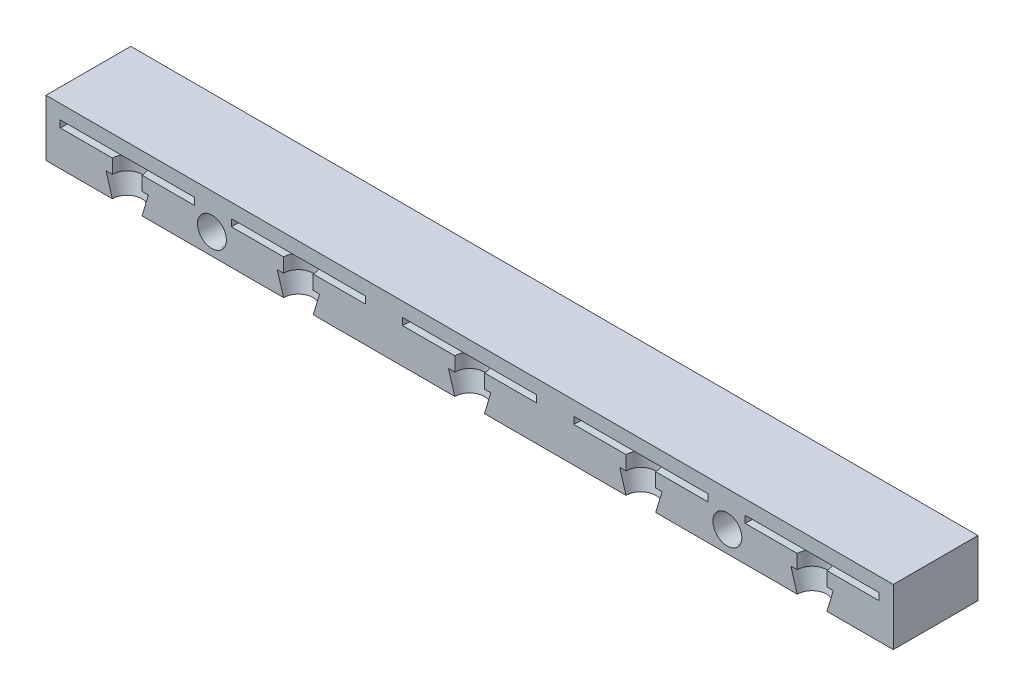
ISO-10303-21;
HEADER;
FILE_DESCRIPTION(('STEP AP214'),'2;1');
FILE_NAME('part.step','',(''),(''),'','','');
FILE_SCHEMA(('AUTOMOTIVE_DESIGN { 1 0 10303 214 1 1 1 1 }'));
ENDSEC;
DATA;
#1=APPLICATION_CONTEXT('core data for automotive mechanical design processes');
#2=APPLICATION_PROTOCOL_DEFINITION('international standard','automotive_design',2000,#1);
#3=PRODUCT_CONTEXT('',#1,'mechanical');
#4=PRODUCT('Part','Part','',(#3));
#5=PRODUCT_RELATED_PRODUCT_CATEGORY('part','',(#4));
#6=PRODUCT_DEFINITION_FORMATION('','',#4);
#7=PRODUCT_DEFINITION_CONTEXT('part definition',#1,'design');
#8=PRODUCT_DEFINITION('design','',#6,#7);
#9=PRODUCT_DEFINITION_SHAPE('','',#8);
#10=(LENGTH_UNIT() NAMED_UNIT(*) SI_UNIT(.MILLI.,.METRE.));
#11=(NAMED_UNIT(*) PLANE_ANGLE_UNIT() SI_UNIT($,.RADIAN.));
#12=(NAMED_UNIT(*) SI_UNIT($,.STERADIAN.) SOLID_ANGLE_UNIT());
#13=UNCERTAINTY_MEASURE_WITH_UNIT(LENGTH_MEASURE(1.E-05),#10,'distance_accuracy_value','');
#14=(GEOMETRIC_REPRESENTATION_CONTEXT(3) GLOBAL_UNCERTAINTY_ASSIGNED_CONTEXT((#13)) GLOBAL_UNIT_ASSIGNED_CONTEXT((#10,
#11,#12)) REPRESENTATION_CONTEXT('',''));
#15=CARTESIAN_POINT('',(0.,0.,0.));
#16=DIRECTION('',(0.,0.,1.));
#17=DIRECTION('',(1.,0.,0.));
#18=AXIS2_PLACEMENT_3D('',#15,#16,#17);
#19=CARTESIAN_POINT('',(0.,0.,-12.));
#20=DIRECTION('',(-1.,0.,0.));
#21=DIRECTION('',(0.,0.,1.));
#22=AXIS2_PLACEMENT_3D('',#19,#20,#21);
#23=PLANE('',#22);
#24=DIRECTION('',(0.,-1.,0.));
#25=VECTOR('',#24,1.);
#26=CARTESIAN_POINT('',(0.,0.,0.));
#27=LINE('',#26,#25);
#28=CARTESIAN_POINT('',(0.,8.,0.));
#29=VERTEX_POINT('',#28);
#30=CARTESIAN_POINT('',(0.,0.,0.));
#31=VERTEX_POINT('',#30);
#32=EDGE_CURVE('E379',#29,#31,#27,.T.);
#33=ORIENTED_EDGE('',*,*,#32,.F.);
#34=DIRECTION('',(0.,0.,1.));
#35=VECTOR('',#34,1.);
#36=CARTESIAN_POINT('',(0.,8.,-12.));
#37=LINE('',#36,#35);
#38=CARTESIAN_POINT('',(0.,8.,-12.));
#39=VERTEX_POINT('',#38);
#40=EDGE_CURVE('E406',#39,#29,#37,.T.);
#41=ORIENTED_EDGE('',*,*,#40,.F.);
#42=DIRECTION('',(0.,-1.,0.));
#43=VECTOR('',#42,1.);
#44=CARTESIAN_POINT('',(0.,0.,-12.));
#45=LINE('',#44,#43);
#46=CARTESIAN_POINT('',(0.,0.,-12.));
#47=VERTEX_POINT('',#46);
#48=EDGE_CURVE('E380',#39,#47,#45,.T.);
#49=ORIENTED_EDGE('',*,*,#48,.T.);
#50=DIRECTION('',(0.,0.,1.));
#51=VECTOR('',#50,1.);
#52=CARTESIAN_POINT('',(0.,0.,-12.));
#53=LINE('',#52,#51);
#54=EDGE_CURVE('E393',#47,#31,#53,.T.);
#55=ORIENTED_EDGE('',*,*,#54,.T.);
#56=EDGE_LOOP('',(#33,#41,#49,#55));
#57=FACE_BOUND('',#56,.T.);
#58=ADVANCED_FACE('F36',(#57),#23,.T.);
#59=CARTESIAN_POINT('',(0.,8.,-12.));
#60=DIRECTION('',(0.,1.,0.));
#61=DIRECTION('',(0.,0.,1.));
#62=AXIS2_PLACEMENT_3D('',#59,#60,#61);
#63=PLANE('',#62);
#64=DIRECTION('',(-1.,0.,0.));
#65=VECTOR('',#64,1.);
#66=CARTESIAN_POINT('',(0.,8.,0.));
#67=LINE('',#66,#65);
#68=CARTESIAN_POINT('',(120.,8.,0.));
#69=VERTEX_POINT('',#68);
#70=EDGE_CURVE('E384',#69,#29,#67,.T.);
#71=ORIENTED_EDGE('',*,*,#70,.F.);
#72=DIRECTION('',(0.,0.,1.));
#73=VECTOR('',#72,1.);
#74=CARTESIAN_POINT('',(120.,8.,-12.));
#75=LINE('',#74,#73);
#76=CARTESIAN_POINT('',(120.,8.,-12.));
#77=VERTEX_POINT('',#76);
#78=EDGE_CURVE('E409',#77,#69,#75,.T.);
#79=ORIENTED_EDGE('',*,*,#78,.F.);
#80=DIRECTION('',(-1.,0.,0.));
#81=VECTOR('',#80,1.);
#82=CARTESIAN_POINT('',(0.,8.,-12.));
#83=LINE('',#82,#81);
#84=EDGE_CURVE('E390',#77,#39,#83,.T.);
#85=ORIENTED_EDGE('',*,*,#84,.T.);
#86=ORIENTED_EDGE('',*,*,#40,.T.);
#87=EDGE_LOOP('',(#71,#79,#85,#86));
#88=FACE_BOUND('',#87,.T.);
#89=ADVANCED_FACE('F548',(#88),#63,.T.);
#90=CARTESIAN_POINT('',(120.,0.,-12.));
#91=DIRECTION('',(1.,0.,0.));
#92=DIRECTION('',(0.,0.,-1.));
#93=AXIS2_PLACEMENT_3D('',#90,#91,#92);
#94=PLANE('',#93);
#95=DIRECTION('',(0.,1.,0.));
#96=VECTOR('',#95,1.);
#97=CARTESIAN_POINT('',(120.,0.,0.));
#98=LINE('',#97,#96);
#99=CARTESIAN_POINT('',(120.,0.,0.));
#100=VERTEX_POINT('',#99);
#101=EDGE_CURVE('E400',#100,#69,#98,.T.);
#102=ORIENTED_EDGE('',*,*,#101,.F.);
#103=DIRECTION('',(0.,0.,1.));
#104=VECTOR('',#103,1.);
#105=CARTESIAN_POINT('',(120.,0.,-12.));
#106=LINE('',#105,#104);
#107=CARTESIAN_POINT('',(120.,0.,-12.));
#108=VERTEX_POINT('',#107);
#109=EDGE_CURVE('E411',#108,#100,#106,.T.);
#110=ORIENTED_EDGE('',*,*,#109,.F.);
#111=DIRECTION('',(0.,1.,0.));
#112=VECTOR('',#111,1.);
#113=CARTESIAN_POINT('',(120.,0.,-12.));
#114=LINE('',#113,#112);
#115=EDGE_CURVE('E387',#108,#77,#114,.T.);
#116=ORIENTED_EDGE('',*,*,#115,.T.);
#117=ORIENTED_EDGE('',*,*,#78,.T.);
#118=EDGE_LOOP('',(#102,#110,#116,#117));
#119=FACE_BOUND('',#118,.T.);
#120=ADVANCED_FACE('F545',(#119),#94,.T.);
#121=CARTESIAN_POINT('',(0.,0.,-12.));
#122=DIRECTION('',(0.,-1.,0.));
#123=DIRECTION('',(0.,0.,-1.));
#124=AXIS2_PLACEMENT_3D('',#121,#122,#123);
#125=PLANE('',#124);
#126=CARTESIAN_POINT('',(108.5,0.,0.));
#127=DIRECTION('',(0.,1.,0.));
#128=DIRECTION('',(-1.,0.,0.));
#129=AXIS2_PLACEMENT_3D('',#126,#127,#128);
#130=CIRCLE('',#129,2.1);
#131=CARTESIAN_POINT('',(110.6,0.,0.));
#132=VERTEX_POINT('',#131);
#133=CARTESIAN_POINT('',(106.4,0.,0.));
#134=VERTEX_POINT('',#133);
#135=EDGE_CURVE('E302',#132,#134,#130,.T.);
#136=ORIENTED_EDGE('',*,*,#135,.T.);
#137=DIRECTION('',(1.,0.,0.));
#138=VECTOR('',#137,1.);
#139=CARTESIAN_POINT('',(0.,0.,0.));
#140=LINE('',#139,#138);
#141=CARTESIAN_POINT('',(86.35,0.,0.));
#142=VERTEX_POINT('',#141);
#143=EDGE_CURVE('E538',#142,#134,#140,.T.);
#144=ORIENTED_EDGE('',*,*,#143,.F.);
#145=CARTESIAN_POINT('',(84.25,0.,0.));
#146=DIRECTION('',(0.,1.,0.));
#147=DIRECTION('',(-1.,0.,0.));
#148=AXIS2_PLACEMENT_3D('',#145,#146,#147);
#149=CIRCLE('',#148,2.1);
#150=CARTESIAN_POINT('',(82.15,0.,0.));
#151=VERTEX_POINT('',#150);
#152=EDGE_CURVE('E322',#142,#151,#149,.T.);
#153=ORIENTED_EDGE('',*,*,#152,.T.);
#154=CARTESIAN_POINT('',(62.1,0.,0.));
#155=VERTEX_POINT('',#154);
#156=EDGE_CURVE('E531',#155,#151,#140,.T.);
#157=ORIENTED_EDGE('',*,*,#156,.F.);
#158=CARTESIAN_POINT('',(60.,0.,0.));
#159=DIRECTION('',(0.,1.,0.));
#160=DIRECTION('',(-1.,0.,0.));
#161=AXIS2_PLACEMENT_3D('',#158,#159,#160);
#162=CIRCLE('',#161,2.1);
#163=CARTESIAN_POINT('',(57.9,0.,0.));
#164=VERTEX_POINT('',#163);
#165=EDGE_CURVE('E340',#155,#164,#162,.T.);
#166=ORIENTED_EDGE('',*,*,#165,.T.);
#167=CARTESIAN_POINT('',(37.85,0.,0.));
#168=VERTEX_POINT('',#167);
#169=EDGE_CURVE('E539',#168,#164,#140,.T.);
#170=ORIENTED_EDGE('',*,*,#169,.F.);
#171=CARTESIAN_POINT('',(35.75,0.,0.));
#172=DIRECTION('',(0.,1.,0.));
#173=DIRECTION('',(-1.,0.,0.));
#174=AXIS2_PLACEMENT_3D('',#171,#172,#173);
#175=CIRCLE('',#174,2.1);
#176=CARTESIAN_POINT('',(33.65,0.,0.));
#177=VERTEX_POINT('',#176);
#178=EDGE_CURVE('E358',#168,#177,#175,.T.);
#179=ORIENTED_EDGE('',*,*,#178,.T.);
#180=CARTESIAN_POINT('',(13.6,0.,0.));
#181=VERTEX_POINT('',#180);
#182=EDGE_CURVE('E401',#181,#177,#140,.T.);
#183=ORIENTED_EDGE('',*,*,#182,.F.);
#184=CARTESIAN_POINT('',(11.5,0.,0.));
#185=DIRECTION('',(0.,1.,0.));
#186=DIRECTION('',(-1.,0.,0.));
#187=AXIS2_PLACEMENT_3D('',#184,#185,#186);
#188=CIRCLE('',#187,2.1);
#189=CARTESIAN_POINT('',(9.39999999999999,0.,0.));
#190=VERTEX_POINT('',#189);
#191=EDGE_CURVE('E376',#181,#190,#188,.T.);
#192=ORIENTED_EDGE('',*,*,#191,.T.);
#193=EDGE_CURVE('E397',#31,#190,#140,.T.);
#194=ORIENTED_EDGE('',*,*,#193,.F.);
#195=ORIENTED_EDGE('',*,*,#54,.F.);
#196=DIRECTION('',(1.,0.,0.));
#197=VECTOR('',#196,1.);
#198=CARTESIAN_POINT('',(0.,0.,-12.));
#199=LINE('',#198,#197);
#200=EDGE_CURVE('E383',#47,#108,#199,.T.);
#201=ORIENTED_EDGE('',*,*,#200,.T.);
#202=ORIENTED_EDGE('',*,*,#109,.T.);
#203=EDGE_CURVE('E396',#132,#100,#140,.T.);
#204=ORIENTED_EDGE('',*,*,#203,.F.);
#205=EDGE_LOOP('',(#136,#144,#153,#157,#166,#170,#179,#183,#192,#194,#195,#201,#202,#204));
#206=FACE_BOUND('',#205,.T.);
#207=ADVANCED_FACE('F537',(#206),#125,.T.);
#208=CARTESIAN_POINT('',(0.,0.,-12.));
#209=DIRECTION('',(0.,0.,-1.));
#210=DIRECTION('',(-1.,0.,0.));
#211=AXIS2_PLACEMENT_3D('',#208,#209,#210);
#212=PLANE('',#211);
#213=ORIENTED_EDGE('',*,*,#48,.F.);
#214=ORIENTED_EDGE('',*,*,#84,.F.);
#215=ORIENTED_EDGE('',*,*,#115,.F.);
#216=ORIENTED_EDGE('',*,*,#200,.F.);
#217=EDGE_LOOP('',(#213,#214,#215,#216));
#218=FACE_BOUND('',#217,.T.);
#219=ADVANCED_FACE('F597',(#218),#212,.T.);
#220=CARTESIAN_POINT('',(0.,0.,0.));
#221=DIRECTION('',(0.,0.,-1.));
#222=DIRECTION('',(-1.,0.,0.));
#223=AXIS2_PLACEMENT_3D('',#220,#221,#222);
#224=PLANE('',#223);
#225=CARTESIAN_POINT('',(23.5,3.,0.));
#226=DIRECTION('',(0.,0.,1.));
#227=DIRECTION('',(1.,0.,0.));
#228=AXIS2_PLACEMENT_3D('',#225,#226,#227);
#229=CIRCLE('',#228,2.05);
#230=CARTESIAN_POINT('',(25.55,3.,0.));
#231=VERTEX_POINT('',#230);
#232=EDGE_CURVE('E909',#231,#231,#229,.T.);
#233=ORIENTED_EDGE('',*,*,#232,.F.);
#234=EDGE_LOOP('',(#233));
#235=FACE_BOUND('',#234,.T.);
#236=CARTESIAN_POINT('',(96.5,3.,0.));
#237=DIRECTION('',(0.,0.,1.));
#238=DIRECTION('',(1.,0.,0.));
#239=AXIS2_PLACEMENT_3D('',#236,#237,#238);
#240=CIRCLE('',#239,2.04999999999999);
#241=CARTESIAN_POINT('',(98.55,3.,0.));
#242=VERTEX_POINT('',#241);
#243=EDGE_CURVE('E915',#242,#242,#240,.T.);
#244=ORIENTED_EDGE('',*,*,#243,.F.);
#245=EDGE_LOOP('',(#244));
#246=FACE_BOUND('',#245,.T.);
#247=ORIENTED_EDGE('',*,*,#143,.T.);
#248=DIRECTION('',(-0.287347885566346,0.957826285221151,0.));
#249=VECTOR('',#248,1.);
#250=CARTESIAN_POINT('',(108.5,-7.,0.));
#251=LINE('',#250,#249);
#252=CARTESIAN_POINT('',(105.5,3.,0.));
#253=VERTEX_POINT('',#252);
#254=EDGE_CURVE('E12',#134,#253,#251,.T.);
#255=ORIENTED_EDGE('',*,*,#254,.T.);
#256=DIRECTION('',(1.,0.,0.));
#257=VECTOR('',#256,1.);
#258=CARTESIAN_POINT('',(0.,2.99999999999997,0.));
#259=LINE('',#258,#257);
#260=CARTESIAN_POINT('',(106.4,3.,0.));
#261=VERTEX_POINT('',#260);
#262=EDGE_CURVE('E287',#253,#261,#259,.T.);
#263=ORIENTED_EDGE('',*,*,#262,.T.);
#264=DIRECTION('',(0.,1.,0.));
#265=VECTOR('',#264,1.);
#266=CARTESIAN_POINT('',(106.4,6.,0.));
#267=LINE('',#266,#265);
#268=CARTESIAN_POINT('',(106.4,5.,0.));
#269=VERTEX_POINT('',#268);
#270=EDGE_CURVE('E283',#261,#269,#267,.T.);
#271=ORIENTED_EDGE('',*,*,#270,.T.);
#272=DIRECTION('',(-1.,0.,0.));
#273=VECTOR('',#272,1.);
#274=CARTESIAN_POINT('',(0.,4.99999999999997,0.));
#275=LINE('',#274,#273);
#276=CARTESIAN_POINT('',(99.,5.,0.));
#277=VERTEX_POINT('',#276);
#278=EDGE_CURVE('E274',#269,#277,#275,.T.);
#279=ORIENTED_EDGE('',*,*,#278,.T.);
#280=DIRECTION('',(0.,1.,0.));
#281=VECTOR('',#280,1.);
#282=CARTESIAN_POINT('',(99.,6.,0.));
#283=LINE('',#282,#281);
#284=CARTESIAN_POINT('',(99.,6.,0.));
#285=VERTEX_POINT('',#284);
#286=EDGE_CURVE('E265',#277,#285,#283,.T.);
#287=ORIENTED_EDGE('',*,*,#286,.T.);
#288=DIRECTION('',(1.,0.,0.));
#289=VECTOR('',#288,1.);
#290=CARTESIAN_POINT('',(0.,5.99999999999997,0.));
#291=LINE('',#290,#289);
#292=CARTESIAN_POINT('',(118.,6.00000000000001,0.));
#293=VERTEX_POINT('',#292);
#294=EDGE_CURVE('E254',#285,#293,#291,.T.);
#295=ORIENTED_EDGE('',*,*,#294,.T.);
#296=DIRECTION('',(0.,1.,0.));
#297=VECTOR('',#296,1.);
#298=CARTESIAN_POINT('',(118.,6.00000000000001,0.));
#299=LINE('',#298,#297);
#300=CARTESIAN_POINT('',(118.,5.00000000000001,0.));
#301=VERTEX_POINT('',#300);
#302=EDGE_CURVE('E259',#293,#301,#299,.F.);
#303=ORIENTED_EDGE('',*,*,#302,.T.);
#304=CARTESIAN_POINT('',(110.6,5.,0.));
#305=VERTEX_POINT('',#304);
#306=EDGE_CURVE('E276',#301,#305,#275,.T.);
#307=ORIENTED_EDGE('',*,*,#306,.T.);
#308=DIRECTION('',(0.,1.,0.));
#309=VECTOR('',#308,1.);
#310=CARTESIAN_POINT('',(110.6,6.00000000000001,0.));
#311=LINE('',#310,#309);
#312=CARTESIAN_POINT('',(110.6,3.,0.));
#313=VERTEX_POINT('',#312);
#314=EDGE_CURVE('E280',#305,#313,#311,.F.);
#315=ORIENTED_EDGE('',*,*,#314,.T.);
#316=CARTESIAN_POINT('',(111.5,3.,0.));
#317=VERTEX_POINT('',#316);
#318=EDGE_CURVE('E285',#313,#317,#259,.T.);
#319=ORIENTED_EDGE('',*,*,#318,.T.);
#320=DIRECTION('',(-0.287347885566345,-0.957826285221152,0.));
#321=VECTOR('',#320,1.);
#322=CARTESIAN_POINT('',(108.5,-7.,0.));
#323=LINE('',#322,#321);
#324=EDGE_CURVE('E43',#317,#132,#323,.T.);
#325=ORIENTED_EDGE('',*,*,#324,.T.);
#326=ORIENTED_EDGE('',*,*,#203,.T.);
#327=ORIENTED_EDGE('',*,*,#101,.T.);
#328=ORIENTED_EDGE('',*,*,#70,.T.);
#329=ORIENTED_EDGE('',*,*,#32,.T.);
#330=ORIENTED_EDGE('',*,*,#193,.T.);
#331=DIRECTION('',(-0.287347885566346,0.957826285221151,0.));
#332=VECTOR('',#331,1.);
#333=CARTESIAN_POINT('',(11.5,-7.,0.));
#334=LINE('',#333,#332);
#335=CARTESIAN_POINT('',(8.49999999999999,3.,0.));
#336=VERTEX_POINT('',#335);
#337=EDGE_CURVE('E440',#190,#336,#334,.T.);
#338=ORIENTED_EDGE('',*,*,#337,.T.);
#339=DIRECTION('',(1.,0.,0.));
#340=VECTOR('',#339,1.);
#341=CARTESIAN_POINT('',(0.,3.,0.));
#342=LINE('',#341,#340);
#343=CARTESIAN_POINT('',(9.39999999999999,3.,0.));
#344=VERTEX_POINT('',#343);
#345=EDGE_CURVE('E436',#336,#344,#342,.T.);
#346=ORIENTED_EDGE('',*,*,#345,.T.);
#347=DIRECTION('',(0.,1.,0.));
#348=VECTOR('',#347,1.);
#349=CARTESIAN_POINT('',(9.39999999999999,6.,0.));
#350=LINE('',#349,#348);
#351=CARTESIAN_POINT('',(9.39999999999999,5.,0.));
#352=VERTEX_POINT('',#351);
#353=EDGE_CURVE('E430',#344,#352,#350,.T.);
#354=ORIENTED_EDGE('',*,*,#353,.T.);
#355=DIRECTION('',(-1.,0.,0.));
#356=VECTOR('',#355,1.);
#357=CARTESIAN_POINT('',(0.,5.,0.));
#358=LINE('',#357,#356);
#359=CARTESIAN_POINT('',(1.99999999999999,5.,0.));
#360=VERTEX_POINT('',#359);
#361=EDGE_CURVE('E423',#352,#360,#358,.T.);
#362=ORIENTED_EDGE('',*,*,#361,.T.);
#363=DIRECTION('',(0.,1.,0.));
#364=VECTOR('',#363,1.);
#365=CARTESIAN_POINT('',(1.99999999999999,6.,0.));
#366=LINE('',#365,#364);
#367=CARTESIAN_POINT('',(1.99999999999999,6.,0.));
#368=VERTEX_POINT('',#367);
#369=EDGE_CURVE('E420',#360,#368,#366,.T.);
#370=ORIENTED_EDGE('',*,*,#369,.T.);
#371=DIRECTION('',(1.,0.,0.));
#372=VECTOR('',#371,1.);
#373=CARTESIAN_POINT('',(0.,6.,0.));
#374=LINE('',#373,#372);
#375=CARTESIAN_POINT('',(21.,6.,0.));
#376=VERTEX_POINT('',#375);
#377=EDGE_CURVE('E408',#368,#376,#374,.T.);
#378=ORIENTED_EDGE('',*,*,#377,.T.);
#379=DIRECTION('',(0.,1.,0.));
#380=VECTOR('',#379,1.);
#381=CARTESIAN_POINT('',(21.,6.00000000000001,0.));
#382=LINE('',#381,#380);
#383=CARTESIAN_POINT('',(21.,5.,0.));
#384=VERTEX_POINT('',#383);
#385=EDGE_CURVE('E417',#376,#384,#382,.F.);
#386=ORIENTED_EDGE('',*,*,#385,.T.);
#387=CARTESIAN_POINT('',(13.6,5.,0.));
#388=VERTEX_POINT('',#387);
#389=EDGE_CURVE('E426',#384,#388,#358,.T.);
#390=ORIENTED_EDGE('',*,*,#389,.T.);
#391=DIRECTION('',(0.,1.,0.));
#392=VECTOR('',#391,1.);
#393=CARTESIAN_POINT('',(13.6,6.,0.));
#394=LINE('',#393,#392);
#395=CARTESIAN_POINT('',(13.6,3.,0.));
#396=VERTEX_POINT('',#395);
#397=EDGE_CURVE('E427',#388,#396,#394,.F.);
#398=ORIENTED_EDGE('',*,*,#397,.T.);
#399=CARTESIAN_POINT('',(14.5,3.,0.));
#400=VERTEX_POINT('',#399);
#401=EDGE_CURVE('E433',#396,#400,#342,.T.);
#402=ORIENTED_EDGE('',*,*,#401,.T.);
#403=DIRECTION('',(-0.287347885566345,-0.957826285221152,0.));
#404=VECTOR('',#403,1.);
#405=CARTESIAN_POINT('',(11.5,-7.,0.));
#406=LINE('',#405,#404);
#407=EDGE_CURVE('E437',#400,#181,#406,.T.);
#408=ORIENTED_EDGE('',*,*,#407,.T.);
#409=ORIENTED_EDGE('',*,*,#182,.T.);
#410=DIRECTION('',(-0.287347885566346,0.957826285221151,0.));
#411=VECTOR('',#410,1.);
#412=CARTESIAN_POINT('',(35.75,-7.,0.));
#413=LINE('',#412,#411);
#414=CARTESIAN_POINT('',(32.75,3.,0.));
#415=VERTEX_POINT('',#414);
#416=EDGE_CURVE('E469',#177,#415,#413,.T.);
#417=ORIENTED_EDGE('',*,*,#416,.T.);
#418=DIRECTION('',(1.,0.,0.));
#419=VECTOR('',#418,1.);
#420=CARTESIAN_POINT('',(0.,2.99999999999999,0.));
#421=LINE('',#420,#419);
#422=CARTESIAN_POINT('',(33.65,3.,0.));
#423=VERTEX_POINT('',#422);
#424=EDGE_CURVE('E465',#415,#423,#421,.T.);
#425=ORIENTED_EDGE('',*,*,#424,.T.);
#426=DIRECTION('',(0.,1.,0.));
#427=VECTOR('',#426,1.);
#428=CARTESIAN_POINT('',(33.65,6.,0.));
#429=LINE('',#428,#427);
#430=CARTESIAN_POINT('',(33.65,5.,0.));
#431=VERTEX_POINT('',#430);
#432=EDGE_CURVE('E459',#423,#431,#429,.T.);
#433=ORIENTED_EDGE('',*,*,#432,.T.);
#434=DIRECTION('',(-1.,0.,0.));
#435=VECTOR('',#434,1.);
#436=CARTESIAN_POINT('',(0.,4.99999999999999,0.));
#437=LINE('',#436,#435);
#438=CARTESIAN_POINT('',(26.25,5.,0.));
#439=VERTEX_POINT('',#438);
#440=EDGE_CURVE('E452',#431,#439,#437,.T.);
#441=ORIENTED_EDGE('',*,*,#440,.T.);
#442=DIRECTION('',(0.,1.,0.));
#443=VECTOR('',#442,1.);
#444=CARTESIAN_POINT('',(26.25,6.,0.));
#445=LINE('',#444,#443);
#446=CARTESIAN_POINT('',(26.25,6.,0.));
#447=VERTEX_POINT('',#446);
#448=EDGE_CURVE('E449',#439,#447,#445,.T.);
#449=ORIENTED_EDGE('',*,*,#448,.T.);
#450=DIRECTION('',(1.,0.,0.));
#451=VECTOR('',#450,1.);
#452=CARTESIAN_POINT('',(0.,5.99999999999999,0.));
#453=LINE('',#452,#451);
#454=CARTESIAN_POINT('',(45.25,6.,0.));
#455=VERTEX_POINT('',#454);
#456=EDGE_CURVE('E443',#447,#455,#453,.T.);
#457=ORIENTED_EDGE('',*,*,#456,.T.);
#458=DIRECTION('',(0.,1.,0.));
#459=VECTOR('',#458,1.);
#460=CARTESIAN_POINT('',(45.25,6.00000000000001,0.));
#461=LINE('',#460,#459);
#462=CARTESIAN_POINT('',(45.25,5.,0.));
#463=VERTEX_POINT('',#462);
#464=EDGE_CURVE('E446',#455,#463,#461,.F.);
#465=ORIENTED_EDGE('',*,*,#464,.T.);
#466=CARTESIAN_POINT('',(37.85,5.,0.));
#467=VERTEX_POINT('',#466);
#468=EDGE_CURVE('E455',#463,#467,#437,.T.);
#469=ORIENTED_EDGE('',*,*,#468,.T.);
#470=DIRECTION('',(0.,1.,0.));
#471=VECTOR('',#470,1.);
#472=CARTESIAN_POINT('',(37.85,6.,0.));
#473=LINE('',#472,#471);
#474=CARTESIAN_POINT('',(37.85,3.,0.));
#475=VERTEX_POINT('',#474);
#476=EDGE_CURVE('E456',#467,#475,#473,.F.);
#477=ORIENTED_EDGE('',*,*,#476,.T.);
#478=CARTESIAN_POINT('',(38.75,3.,0.));
#479=VERTEX_POINT('',#478);
#480=EDGE_CURVE('E462',#475,#479,#421,.T.);
#481=ORIENTED_EDGE('',*,*,#480,.T.);
#482=DIRECTION('',(-0.287347885566345,-0.957826285221152,0.));
#483=VECTOR('',#482,1.);
#484=CARTESIAN_POINT('',(35.75,-7.,0.));
#485=LINE('',#484,#483);
#486=EDGE_CURVE('E466',#479,#168,#485,.T.);
#487=ORIENTED_EDGE('',*,*,#486,.T.);
#488=ORIENTED_EDGE('',*,*,#169,.T.);
#489=DIRECTION('',(-0.287347885566346,0.957826285221151,0.));
#490=VECTOR('',#489,1.);
#491=CARTESIAN_POINT('',(60.,-7.,0.));
#492=LINE('',#491,#490);
#493=CARTESIAN_POINT('',(57.,3.,0.));
#494=VERTEX_POINT('',#493);
#495=EDGE_CURVE('E498',#164,#494,#492,.T.);
#496=ORIENTED_EDGE('',*,*,#495,.T.);
#497=DIRECTION('',(1.,0.,0.));
#498=VECTOR('',#497,1.);
#499=CARTESIAN_POINT('',(0.,2.99999999999998,0.));
#500=LINE('',#499,#498);
#501=CARTESIAN_POINT('',(57.9,3.,0.));
#502=VERTEX_POINT('',#501);
#503=EDGE_CURVE('E494',#494,#502,#500,.T.);
#504=ORIENTED_EDGE('',*,*,#503,.T.);
#505=DIRECTION('',(0.,1.,0.));
#506=VECTOR('',#505,1.);
#507=CARTESIAN_POINT('',(57.9,6.,0.));
#508=LINE('',#507,#506);
#509=CARTESIAN_POINT('',(57.9,5.,0.));
#510=VERTEX_POINT('',#509);
#511=EDGE_CURVE('E488',#502,#510,#508,.T.);
#512=ORIENTED_EDGE('',*,*,#511,.T.);
#513=DIRECTION('',(-1.,0.,0.));
#514=VECTOR('',#513,1.);
#515=CARTESIAN_POINT('',(0.,4.99999999999999,0.));
#516=LINE('',#515,#514);
#517=CARTESIAN_POINT('',(50.5,5.,0.));
#518=VERTEX_POINT('',#517);
#519=EDGE_CURVE('E481',#510,#518,#516,.T.);
#520=ORIENTED_EDGE('',*,*,#519,.T.);
#521=DIRECTION('',(0.,1.,0.));
#522=VECTOR('',#521,1.);
#523=CARTESIAN_POINT('',(50.5,6.,0.));
#524=LINE('',#523,#522);
#525=CARTESIAN_POINT('',(50.5,6.,0.));
#526=VERTEX_POINT('',#525);
#527=EDGE_CURVE('E478',#518,#526,#524,.T.);
#528=ORIENTED_EDGE('',*,*,#527,.T.);
#529=DIRECTION('',(1.,0.,0.));
#530=VECTOR('',#529,1.);
#531=CARTESIAN_POINT('',(0.,5.99999999999999,0.));
#532=LINE('',#531,#530);
#533=CARTESIAN_POINT('',(69.5,6.00000000000001,0.));
#534=VERTEX_POINT('',#533);
#535=EDGE_CURVE('E472',#526,#534,#532,.T.);
#536=ORIENTED_EDGE('',*,*,#535,.T.);
#537=DIRECTION('',(0.,1.,0.));
#538=VECTOR('',#537,1.);
#539=CARTESIAN_POINT('',(69.5,6.00000000000001,0.));
#540=LINE('',#539,#538);
#541=CARTESIAN_POINT('',(69.5,5.,0.));
#542=VERTEX_POINT('',#541);
#543=EDGE_CURVE('E475',#534,#542,#540,.F.);
#544=ORIENTED_EDGE('',*,*,#543,.T.);
#545=CARTESIAN_POINT('',(62.1,5.,0.));
#546=VERTEX_POINT('',#545);
#547=EDGE_CURVE('E484',#542,#546,#516,.T.);
#548=ORIENTED_EDGE('',*,*,#547,.T.);
#549=DIRECTION('',(0.,1.,0.));
#550=VECTOR('',#549,1.);
#551=CARTESIAN_POINT('',(62.1,6.00000000000001,0.));
#552=LINE('',#551,#550);
#553=CARTESIAN_POINT('',(62.1,3.,0.));
#554=VERTEX_POINT('',#553);
#555=EDGE_CURVE('E485',#546,#554,#552,.F.);
#556=ORIENTED_EDGE('',*,*,#555,.T.);
#557=CARTESIAN_POINT('',(63.,3.,0.));
#558=VERTEX_POINT('',#557);
#559=EDGE_CURVE('E491',#554,#558,#500,.T.);
#560=ORIENTED_EDGE('',*,*,#559,.T.);
#561=DIRECTION('',(-0.287347885566345,-0.957826285221152,0.));
#562=VECTOR('',#561,1.);
#563=CARTESIAN_POINT('',(60.,-7.,0.));
#564=LINE('',#563,#562);
#565=EDGE_CURVE('E495',#558,#155,#564,.T.);
#566=ORIENTED_EDGE('',*,*,#565,.T.);
#567=ORIENTED_EDGE('',*,*,#156,.T.);
#568=DIRECTION('',(-0.287347885566346,0.957826285221151,0.));
#569=VECTOR('',#568,1.);
#570=CARTESIAN_POINT('',(84.25,-7.,0.));
#571=LINE('',#570,#569);
#572=CARTESIAN_POINT('',(81.25,3.,0.));
#573=VERTEX_POINT('',#572);
#574=EDGE_CURVE('E260',#151,#573,#571,.T.);
#575=ORIENTED_EDGE('',*,*,#574,.T.);
#576=DIRECTION('',(1.,0.,0.));
#577=VECTOR('',#576,1.);
#578=CARTESIAN_POINT('',(0.,2.99999999999998,0.));
#579=LINE('',#578,#577);
#580=CARTESIAN_POINT('',(82.15,3.,0.));
#581=VERTEX_POINT('',#580);
#582=EDGE_CURVE('E523',#573,#581,#579,.T.);
#583=ORIENTED_EDGE('',*,*,#582,.T.);
#584=DIRECTION('',(0.,1.,0.));
#585=VECTOR('',#584,1.);
#586=CARTESIAN_POINT('',(82.15,6.,0.));
#587=LINE('',#586,#585);
#588=CARTESIAN_POINT('',(82.15,5.,0.));
#589=VERTEX_POINT('',#588);
#590=EDGE_CURVE('E517',#581,#589,#587,.T.);
#591=ORIENTED_EDGE('',*,*,#590,.T.);
#592=DIRECTION('',(-1.,0.,0.));
#593=VECTOR('',#592,1.);
#594=CARTESIAN_POINT('',(0.,4.99999999999998,0.));
#595=LINE('',#594,#593);
#596=CARTESIAN_POINT('',(74.75,5.,0.));
#597=VERTEX_POINT('',#596);
#598=EDGE_CURVE('E510',#589,#597,#595,.T.);
#599=ORIENTED_EDGE('',*,*,#598,.T.);
#600=DIRECTION('',(0.,1.,0.));
#601=VECTOR('',#600,1.);
#602=CARTESIAN_POINT('',(74.75,6.,0.));
#603=LINE('',#602,#601);
#604=CARTESIAN_POINT('',(74.75,6.,0.));
#605=VERTEX_POINT('',#604);
#606=EDGE_CURVE('E507',#597,#605,#603,.T.);
#607=ORIENTED_EDGE('',*,*,#606,.T.);
#608=DIRECTION('',(1.,0.,0.));
#609=VECTOR('',#608,1.);
#610=CARTESIAN_POINT('',(0.,5.99999999999998,0.));
#611=LINE('',#610,#609);
#612=CARTESIAN_POINT('',(93.75,6.00000000000001,0.));
#613=VERTEX_POINT('',#612);
#614=EDGE_CURVE('E501',#605,#613,#611,.T.);
#615=ORIENTED_EDGE('',*,*,#614,.T.);
#616=DIRECTION('',(0.,1.,0.));
#617=VECTOR('',#616,1.);
#618=CARTESIAN_POINT('',(93.75,6.00000000000001,0.));
#619=LINE('',#618,#617);
#620=CARTESIAN_POINT('',(93.75,5.,0.));
#621=VERTEX_POINT('',#620);
#622=EDGE_CURVE('E504',#613,#621,#619,.F.);
#623=ORIENTED_EDGE('',*,*,#622,.T.);
#624=CARTESIAN_POINT('',(86.35,5.,0.));
#625=VERTEX_POINT('',#624);
#626=EDGE_CURVE('E513',#621,#625,#595,.T.);
#627=ORIENTED_EDGE('',*,*,#626,.T.);
#628=DIRECTION('',(0.,1.,0.));
#629=VECTOR('',#628,1.);
#630=CARTESIAN_POINT('',(86.35,6.00000000000001,0.));
#631=LINE('',#630,#629);
#632=CARTESIAN_POINT('',(86.35,3.,0.));
#633=VERTEX_POINT('',#632);
#634=EDGE_CURVE('E514',#625,#633,#631,.F.);
#635=ORIENTED_EDGE('',*,*,#634,.T.);
#636=CARTESIAN_POINT('',(87.25,3.,0.));
#637=VERTEX_POINT('',#636);
#638=EDGE_CURVE('E520',#633,#637,#579,.T.);
#639=ORIENTED_EDGE('',*,*,#638,.T.);
#640=DIRECTION('',(-0.287347885566345,-0.957826285221152,0.));
#641=VECTOR('',#640,1.);
#642=CARTESIAN_POINT('',(84.25,-7.,0.));
#643=LINE('',#642,#641);
#644=EDGE_CURVE('E524',#637,#142,#643,.T.);
#645=ORIENTED_EDGE('',*,*,#644,.T.);
#646=EDGE_LOOP('',(#247,#255,#263,#271,#279,#287,#295,#303,#307,#315,#319,#325,#326,#327,#328,
#329,#330,#338,#346,#354,#362,#370,#378,#386,#390,#398,#402,#408,#409,#417,#425,#433,#441,#449,
#457,#465,#469,#477,#481,#487,#488,#496,#504,#512,#520,#528,#536,#544,#548,#556,#560,#566,#567,
#575,#583,#591,#599,#607,#615,#623,#627,#635,#639,#645));
#647=FACE_BOUND('',#646,.T.);
#648=ADVANCED_FACE('F272',(#235,#246,#647),#224,.F.);
#649=CARTESIAN_POINT('',(11.5,3.,0.));
#650=DIRECTION('',(0.,1.,0.));
#651=DIRECTION('',(-1.,0.,0.));
#652=AXIS2_PLACEMENT_3D('',#649,#650,#651);
#653=CONICAL_SURFACE('',#652,3.,0.291456794477867);
#654=ORIENTED_EDGE('',*,*,#191,.F.);
#655=ORIENTED_EDGE('',*,*,#407,.F.);
#656=CARTESIAN_POINT('',(11.5,3.,0.));
#657=DIRECTION('',(0.,1.,0.));
#658=DIRECTION('',(-1.,0.,0.));
#659=AXIS2_PLACEMENT_3D('',#656,#657,#658);
#660=CIRCLE('',#659,3.);
#661=EDGE_CURVE('E373',#400,#336,#660,.T.);
#662=ORIENTED_EDGE('',*,*,#661,.T.);
#663=ORIENTED_EDGE('',*,*,#337,.F.);
#664=EDGE_LOOP('',(#654,#655,#662,#663));
#665=FACE_BOUND('',#664,.T.);
#666=ADVANCED_FACE('F556',(#665),#653,.F.);
#667=CARTESIAN_POINT('',(8.49999999999999,3.,0.));
#668=DIRECTION('',(0.,1.,0.));
#669=DIRECTION('',(-1.,0.,0.));
#670=AXIS2_PLACEMENT_3D('',#667,#668,#669);
#671=PLANE('',#670);
#672=ORIENTED_EDGE('',*,*,#661,.F.);
#673=ORIENTED_EDGE('',*,*,#401,.F.);
#674=CARTESIAN_POINT('',(11.5,3.,0.));
#675=DIRECTION('',(0.,1.,0.));
#676=DIRECTION('',(-1.,0.,0.));
#677=AXIS2_PLACEMENT_3D('',#674,#675,#676);
#678=CIRCLE('',#677,2.1);
#679=EDGE_CURVE('E370',#396,#344,#678,.T.);
#680=ORIENTED_EDGE('',*,*,#679,.T.);
#681=ORIENTED_EDGE('',*,*,#345,.F.);
#682=EDGE_LOOP('',(#672,#673,#680,#681));
#683=FACE_BOUND('',#682,.T.);
#684=ADVANCED_FACE('F561',(#683),#671,.F.);
#685=CARTESIAN_POINT('',(11.5,6.,0.));
#686=DIRECTION('',(0.,1.,0.));
#687=DIRECTION('',(-1.,0.,0.));
#688=AXIS2_PLACEMENT_3D('',#685,#686,#687);
#689=CYLINDRICAL_SURFACE('',#688,2.1);
#690=ORIENTED_EDGE('',*,*,#679,.F.);
#691=ORIENTED_EDGE('',*,*,#397,.F.);
#692=CARTESIAN_POINT('',(11.5,5.,0.));
#693=DIRECTION('',(0.,1.,0.));
#694=DIRECTION('',(-1.,0.,0.));
#695=AXIS2_PLACEMENT_3D('',#692,#693,#694);
#696=CIRCLE('',#695,2.1);
#697=EDGE_CURVE('E367',#388,#352,#696,.T.);
#698=ORIENTED_EDGE('',*,*,#697,.T.);
#699=ORIENTED_EDGE('',*,*,#353,.F.);
#700=EDGE_LOOP('',(#690,#691,#698,#699));
#701=FACE_BOUND('',#700,.T.);
#702=ADVANCED_FACE('F564',(#701),#689,.F.);
#703=CARTESIAN_POINT('',(9.39999999999999,5.,0.));
#704=DIRECTION('',(0.,-1.,0.));
#705=DIRECTION('',(1.,0.,0.));
#706=AXIS2_PLACEMENT_3D('',#703,#704,#705);
#707=PLANE('',#706);
#708=CARTESIAN_POINT('',(11.5,5.,0.));
#709=DIRECTION('',(0.,1.,0.));
#710=DIRECTION('',(-1.,0.,0.));
#711=AXIS2_PLACEMENT_3D('',#708,#709,#710);
#712=CIRCLE('',#711,9.5);
#713=EDGE_CURVE('E364',#384,#360,#712,.T.);
#714=ORIENTED_EDGE('',*,*,#713,.T.);
#715=ORIENTED_EDGE('',*,*,#361,.F.);
#716=ORIENTED_EDGE('',*,*,#697,.F.);
#717=ORIENTED_EDGE('',*,*,#389,.F.);
#718=EDGE_LOOP('',(#714,#715,#716,#717));
#719=FACE_BOUND('',#718,.T.);
#720=ADVANCED_FACE('F567',(#719),#707,.F.);
#721=CARTESIAN_POINT('',(11.5,6.,0.));
#722=DIRECTION('',(0.,1.,0.));
#723=DIRECTION('',(-1.,0.,0.));
#724=AXIS2_PLACEMENT_3D('',#721,#722,#723);
#725=CYLINDRICAL_SURFACE('',#724,9.5);
#726=ORIENTED_EDGE('',*,*,#713,.F.);
#727=ORIENTED_EDGE('',*,*,#385,.F.);
#728=CARTESIAN_POINT('',(11.5,6.,0.));
#729=DIRECTION('',(0.,1.,0.));
#730=DIRECTION('',(-1.,0.,0.));
#731=AXIS2_PLACEMENT_3D('',#728,#729,#730);
#732=CIRCLE('',#731,9.5);
#733=EDGE_CURVE('E361',#376,#368,#732,.T.);
#734=ORIENTED_EDGE('',*,*,#733,.T.);
#735=ORIENTED_EDGE('',*,*,#369,.F.);
#736=EDGE_LOOP('',(#726,#727,#734,#735));
#737=FACE_BOUND('',#736,.T.);
#738=ADVANCED_FACE('F571',(#737),#725,.F.);
#739=CARTESIAN_POINT('',(1.99999999999999,6.,0.));
#740=DIRECTION('',(0.,1.,0.));
#741=DIRECTION('',(-1.,0.,0.));
#742=AXIS2_PLACEMENT_3D('',#739,#740,#741);
#743=PLANE('',#742);
#744=ORIENTED_EDGE('',*,*,#733,.F.);
#745=ORIENTED_EDGE('',*,*,#377,.F.);
#746=EDGE_LOOP('',(#744,#745));
#747=FACE_BOUND('',#746,.T.);
#748=ADVANCED_FACE('F573',(#747),#743,.F.);
#749=CARTESIAN_POINT('',(35.75,3.,0.));
#750=DIRECTION('',(0.,1.,0.));
#751=DIRECTION('',(-1.,0.,0.));
#752=AXIS2_PLACEMENT_3D('',#749,#750,#751);
#753=CONICAL_SURFACE('',#752,3.,0.291456794477867);
#754=ORIENTED_EDGE('',*,*,#178,.F.);
#755=ORIENTED_EDGE('',*,*,#486,.F.);
#756=CARTESIAN_POINT('',(35.75,3.,0.));
#757=DIRECTION('',(0.,1.,0.));
#758=DIRECTION('',(-1.,0.,0.));
#759=AXIS2_PLACEMENT_3D('',#756,#757,#758);
#760=CIRCLE('',#759,3.);
#761=EDGE_CURVE('E355',#479,#415,#760,.T.);
#762=ORIENTED_EDGE('',*,*,#761,.T.);
#763=ORIENTED_EDGE('',*,*,#416,.F.);
#764=EDGE_LOOP('',(#754,#755,#762,#763));
#765=FACE_BOUND('',#764,.T.);
#766=ADVANCED_FACE('F575',(#765),#753,.F.);
#767=CARTESIAN_POINT('',(32.75,3.,0.));
#768=DIRECTION('',(0.,1.,0.));
#769=DIRECTION('',(-1.,0.,0.));
#770=AXIS2_PLACEMENT_3D('',#767,#768,#769);
#771=PLANE('',#770);
#772=ORIENTED_EDGE('',*,*,#761,.F.);
#773=ORIENTED_EDGE('',*,*,#480,.F.);
#774=CARTESIAN_POINT('',(35.75,3.,0.));
#775=DIRECTION('',(0.,1.,0.));
#776=DIRECTION('',(-1.,0.,0.));
#777=AXIS2_PLACEMENT_3D('',#774,#775,#776);
#778=CIRCLE('',#777,2.1);
#779=EDGE_CURVE('E352',#475,#423,#778,.T.);
#780=ORIENTED_EDGE('',*,*,#779,.T.);
#781=ORIENTED_EDGE('',*,*,#424,.F.);
#782=EDGE_LOOP('',(#772,#773,#780,#781));
#783=FACE_BOUND('',#782,.T.);
#784=ADVANCED_FACE('F581',(#783),#771,.F.);
#785=CARTESIAN_POINT('',(35.75,6.,0.));
#786=DIRECTION('',(0.,1.,0.));
#787=DIRECTION('',(-1.,0.,0.));
#788=AXIS2_PLACEMENT_3D('',#785,#786,#787);
#789=CYLINDRICAL_SURFACE('',#788,2.1);
#790=ORIENTED_EDGE('',*,*,#779,.F.);
#791=ORIENTED_EDGE('',*,*,#476,.F.);
#792=CARTESIAN_POINT('',(35.75,5.,0.));
#793=DIRECTION('',(0.,1.,0.));
#794=DIRECTION('',(-1.,0.,0.));
#795=AXIS2_PLACEMENT_3D('',#792,#793,#794);
#796=CIRCLE('',#795,2.1);
#797=EDGE_CURVE('E349',#467,#431,#796,.T.);
#798=ORIENTED_EDGE('',*,*,#797,.T.);
#799=ORIENTED_EDGE('',*,*,#432,.F.);
#800=EDGE_LOOP('',(#790,#791,#798,#799));
#801=FACE_BOUND('',#800,.T.);
#802=ADVANCED_FACE('F647',(#801),#789,.F.);
#803=CARTESIAN_POINT('',(33.65,5.,0.));
#804=DIRECTION('',(0.,-1.,0.));
#805=DIRECTION('',(1.,0.,0.));
#806=AXIS2_PLACEMENT_3D('',#803,#804,#805);
#807=PLANE('',#806);
#808=CARTESIAN_POINT('',(35.75,5.,0.));
#809=DIRECTION('',(0.,1.,0.));
#810=DIRECTION('',(-1.,0.,0.));
#811=AXIS2_PLACEMENT_3D('',#808,#809,#810);
#812=CIRCLE('',#811,9.5);
#813=EDGE_CURVE('E346',#463,#439,#812,.T.);
#814=ORIENTED_EDGE('',*,*,#813,.T.);
#815=ORIENTED_EDGE('',*,*,#440,.F.);
#816=ORIENTED_EDGE('',*,*,#797,.F.);
#817=ORIENTED_EDGE('',*,*,#468,.F.);
#818=EDGE_LOOP('',(#814,#815,#816,#817));
#819=FACE_BOUND('',#818,.T.);
#820=ADVANCED_FACE('F657',(#819),#807,.F.);
#821=CARTESIAN_POINT('',(35.75,6.,0.));
#822=DIRECTION('',(0.,1.,0.));
#823=DIRECTION('',(-1.,0.,0.));
#824=AXIS2_PLACEMENT_3D('',#821,#822,#823);
#825=CYLINDRICAL_SURFACE('',#824,9.5);
#826=ORIENTED_EDGE('',*,*,#813,.F.);
#827=ORIENTED_EDGE('',*,*,#464,.F.);
#828=CARTESIAN_POINT('',(35.75,6.,0.));
#829=DIRECTION('',(0.,1.,0.));
#830=DIRECTION('',(-1.,0.,0.));
#831=AXIS2_PLACEMENT_3D('',#828,#829,#830);
#832=CIRCLE('',#831,9.5);
#833=EDGE_CURVE('E343',#455,#447,#832,.T.);
#834=ORIENTED_EDGE('',*,*,#833,.T.);
#835=ORIENTED_EDGE('',*,*,#448,.F.);
#836=EDGE_LOOP('',(#826,#827,#834,#835));
#837=FACE_BOUND('',#836,.T.);
#838=ADVANCED_FACE('F667',(#837),#825,.F.);
#839=CARTESIAN_POINT('',(26.25,6.,0.));
#840=DIRECTION('',(0.,1.,0.));
#841=DIRECTION('',(-1.,0.,0.));
#842=AXIS2_PLACEMENT_3D('',#839,#840,#841);
#843=PLANE('',#842);
#844=ORIENTED_EDGE('',*,*,#833,.F.);
#845=ORIENTED_EDGE('',*,*,#456,.F.);
#846=EDGE_LOOP('',(#844,#845));
#847=FACE_BOUND('',#846,.T.);
#848=ADVANCED_FACE('F677',(#847),#843,.F.);
#849=CARTESIAN_POINT('',(60.,3.,0.));
#850=DIRECTION('',(0.,1.,0.));
#851=DIRECTION('',(-1.,0.,0.));
#852=AXIS2_PLACEMENT_3D('',#849,#850,#851);
#853=CONICAL_SURFACE('',#852,3.,0.291456794477867);
#854=ORIENTED_EDGE('',*,*,#165,.F.);
#855=ORIENTED_EDGE('',*,*,#565,.F.);
#856=CARTESIAN_POINT('',(60.,3.,0.));
#857=DIRECTION('',(0.,1.,0.));
#858=DIRECTION('',(-1.,0.,0.));
#859=AXIS2_PLACEMENT_3D('',#856,#857,#858);
#860=CIRCLE('',#859,3.);
#861=EDGE_CURVE('E337',#558,#494,#860,.T.);
#862=ORIENTED_EDGE('',*,*,#861,.T.);
#863=ORIENTED_EDGE('',*,*,#495,.F.);
#864=EDGE_LOOP('',(#854,#855,#862,#863));
#865=FACE_BOUND('',#864,.T.);
#866=ADVANCED_FACE('F687',(#865),#853,.F.);
#867=CARTESIAN_POINT('',(57.,3.,0.));
#868=DIRECTION('',(0.,1.,0.));
#869=DIRECTION('',(-1.,0.,0.));
#870=AXIS2_PLACEMENT_3D('',#867,#868,#869);
#871=PLANE('',#870);
#872=ORIENTED_EDGE('',*,*,#861,.F.);
#873=ORIENTED_EDGE('',*,*,#559,.F.);
#874=CARTESIAN_POINT('',(60.,3.,0.));
#875=DIRECTION('',(0.,1.,0.));
#876=DIRECTION('',(-1.,0.,0.));
#877=AXIS2_PLACEMENT_3D('',#874,#875,#876);
#878=CIRCLE('',#877,2.1);
#879=EDGE_CURVE('E334',#554,#502,#878,.T.);
#880=ORIENTED_EDGE('',*,*,#879,.T.);
#881=ORIENTED_EDGE('',*,*,#503,.F.);
#882=EDGE_LOOP('',(#872,#873,#880,#881));
#883=FACE_BOUND('',#882,.T.);
#884=ADVANCED_FACE('F697',(#883),#871,.F.);
#885=CARTESIAN_POINT('',(60.,6.,0.));
#886=DIRECTION('',(0.,1.,0.));
#887=DIRECTION('',(-1.,0.,0.));
#888=AXIS2_PLACEMENT_3D('',#885,#886,#887);
#889=CYLINDRICAL_SURFACE('',#888,2.1);
#890=ORIENTED_EDGE('',*,*,#879,.F.);
#891=ORIENTED_EDGE('',*,*,#555,.F.);
#892=CARTESIAN_POINT('',(60.,5.,0.));
#893=DIRECTION('',(0.,1.,0.));
#894=DIRECTION('',(-1.,0.,0.));
#895=AXIS2_PLACEMENT_3D('',#892,#893,#894);
#896=CIRCLE('',#895,2.1);
#897=EDGE_CURVE('E331',#546,#510,#896,.T.);
#898=ORIENTED_EDGE('',*,*,#897,.T.);
#899=ORIENTED_EDGE('',*,*,#511,.F.);
#900=EDGE_LOOP('',(#890,#891,#898,#899));
#901=FACE_BOUND('',#900,.T.);
#902=ADVANCED_FACE('F707',(#901),#889,.F.);
#903=CARTESIAN_POINT('',(57.9,5.,0.));
#904=DIRECTION('',(0.,-1.,0.));
#905=DIRECTION('',(1.,0.,0.));
#906=AXIS2_PLACEMENT_3D('',#903,#904,#905);
#907=PLANE('',#906);
#908=CARTESIAN_POINT('',(60.,5.,0.));
#909=DIRECTION('',(0.,1.,0.));
#910=DIRECTION('',(-1.,0.,0.));
#911=AXIS2_PLACEMENT_3D('',#908,#909,#910);
#912=CIRCLE('',#911,9.5);
#913=EDGE_CURVE('E328',#542,#518,#912,.T.);
#914=ORIENTED_EDGE('',*,*,#913,.T.);
#915=ORIENTED_EDGE('',*,*,#519,.F.);
#916=ORIENTED_EDGE('',*,*,#897,.F.);
#917=ORIENTED_EDGE('',*,*,#547,.F.);
#918=EDGE_LOOP('',(#914,#915,#916,#917));
#919=FACE_BOUND('',#918,.T.);
#920=ADVANCED_FACE('F717',(#919),#907,.F.);
#921=CARTESIAN_POINT('',(60.,6.,0.));
#922=DIRECTION('',(0.,1.,0.));
#923=DIRECTION('',(-1.,0.,0.));
#924=AXIS2_PLACEMENT_3D('',#921,#922,#923);
#925=CYLINDRICAL_SURFACE('',#924,9.5);
#926=ORIENTED_EDGE('',*,*,#913,.F.);
#927=ORIENTED_EDGE('',*,*,#543,.F.);
#928=CARTESIAN_POINT('',(60.,6.,0.));
#929=DIRECTION('',(0.,1.,0.));
#930=DIRECTION('',(-1.,0.,0.));
#931=AXIS2_PLACEMENT_3D('',#928,#929,#930);
#932=CIRCLE('',#931,9.5);
#933=EDGE_CURVE('E325',#534,#526,#932,.T.);
#934=ORIENTED_EDGE('',*,*,#933,.T.);
#935=ORIENTED_EDGE('',*,*,#527,.F.);
#936=EDGE_LOOP('',(#926,#927,#934,#935));
#937=FACE_BOUND('',#936,.T.);
#938=ADVANCED_FACE('F727',(#937),#925,.F.);
#939=CARTESIAN_POINT('',(50.5,6.,0.));
#940=DIRECTION('',(0.,1.,0.));
#941=DIRECTION('',(-1.,0.,0.));
#942=AXIS2_PLACEMENT_3D('',#939,#940,#941);
#943=PLANE('',#942);
#944=ORIENTED_EDGE('',*,*,#933,.F.);
#945=ORIENTED_EDGE('',*,*,#535,.F.);
#946=EDGE_LOOP('',(#944,#945));
#947=FACE_BOUND('',#946,.T.);
#948=ADVANCED_FACE('F737',(#947),#943,.F.);
#949=CARTESIAN_POINT('',(84.25,3.,0.));
#950=DIRECTION('',(0.,1.,0.));
#951=DIRECTION('',(-1.,0.,0.));
#952=AXIS2_PLACEMENT_3D('',#949,#950,#951);
#953=CONICAL_SURFACE('',#952,3.,0.291456794477867);
#954=ORIENTED_EDGE('',*,*,#152,.F.);
#955=ORIENTED_EDGE('',*,*,#644,.F.);
#956=CARTESIAN_POINT('',(84.25,3.,0.));
#957=DIRECTION('',(0.,1.,0.));
#958=DIRECTION('',(-1.,0.,0.));
#959=AXIS2_PLACEMENT_3D('',#956,#957,#958);
#960=CIRCLE('',#959,3.);
#961=EDGE_CURVE('E319',#637,#573,#960,.T.);
#962=ORIENTED_EDGE('',*,*,#961,.T.);
#963=ORIENTED_EDGE('',*,*,#574,.F.);
#964=EDGE_LOOP('',(#954,#955,#962,#963));
#965=FACE_BOUND('',#964,.T.);
#966=ADVANCED_FACE('F533',(#965),#953,.F.);
#967=CARTESIAN_POINT('',(81.25,3.,0.));
#968=DIRECTION('',(0.,1.,0.));
#969=DIRECTION('',(-1.,0.,0.));
#970=AXIS2_PLACEMENT_3D('',#967,#968,#969);
#971=PLANE('',#970);
#972=ORIENTED_EDGE('',*,*,#961,.F.);
#973=ORIENTED_EDGE('',*,*,#638,.F.);
#974=CARTESIAN_POINT('',(84.25,3.,0.));
#975=DIRECTION('',(0.,1.,0.));
#976=DIRECTION('',(-1.,0.,0.));
#977=AXIS2_PLACEMENT_3D('',#974,#975,#976);
#978=CIRCLE('',#977,2.1);
#979=EDGE_CURVE('E316',#633,#581,#978,.T.);
#980=ORIENTED_EDGE('',*,*,#979,.T.);
#981=ORIENTED_EDGE('',*,*,#582,.F.);
#982=EDGE_LOOP('',(#972,#973,#980,#981));
#983=FACE_BOUND('',#982,.T.);
#984=ADVANCED_FACE('F756',(#983),#971,.F.);
#985=CARTESIAN_POINT('',(84.25,6.,0.));
#986=DIRECTION('',(0.,1.,0.));
#987=DIRECTION('',(-1.,0.,0.));
#988=AXIS2_PLACEMENT_3D('',#985,#986,#987);
#989=CYLINDRICAL_SURFACE('',#988,2.1);
#990=ORIENTED_EDGE('',*,*,#979,.F.);
#991=ORIENTED_EDGE('',*,*,#634,.F.);
#992=CARTESIAN_POINT('',(84.25,5.,0.));
#993=DIRECTION('',(0.,1.,0.));
#994=DIRECTION('',(-1.,0.,0.));
#995=AXIS2_PLACEMENT_3D('',#992,#993,#994);
#996=CIRCLE('',#995,2.1);
#997=EDGE_CURVE('E313',#625,#589,#996,.T.);
#998=ORIENTED_EDGE('',*,*,#997,.T.);
#999=ORIENTED_EDGE('',*,*,#590,.F.);
#1000=EDGE_LOOP('',(#990,#991,#998,#999));
#1001=FACE_BOUND('',#1000,.T.);
#1002=ADVANCED_FACE('F765',(#1001),#989,.F.);
#1003=CARTESIAN_POINT('',(82.15,5.,0.));
#1004=DIRECTION('',(0.,-1.,0.));
#1005=DIRECTION('',(1.,0.,0.));
#1006=AXIS2_PLACEMENT_3D('',#1003,#1004,#1005);
#1007=PLANE('',#1006);
#1008=CARTESIAN_POINT('',(84.25,5.,0.));
#1009=DIRECTION('',(0.,1.,0.));
#1010=DIRECTION('',(-1.,0.,0.));
#1011=AXIS2_PLACEMENT_3D('',#1008,#1009,#1010);
#1012=CIRCLE('',#1011,9.5);
#1013=EDGE_CURVE('E310',#621,#597,#1012,.T.);
#1014=ORIENTED_EDGE('',*,*,#1013,.T.);
#1015=ORIENTED_EDGE('',*,*,#598,.F.);
#1016=ORIENTED_EDGE('',*,*,#997,.F.);
#1017=ORIENTED_EDGE('',*,*,#626,.F.);
#1018=EDGE_LOOP('',(#1014,#1015,#1016,#1017));
#1019=FACE_BOUND('',#1018,.T.);
#1020=ADVANCED_FACE('F775',(#1019),#1007,.F.);
#1021=CARTESIAN_POINT('',(84.25,6.,0.));
#1022=DIRECTION('',(0.,1.,0.));
#1023=DIRECTION('',(-1.,0.,0.));
#1024=AXIS2_PLACEMENT_3D('',#1021,#1022,#1023);
#1025=CYLINDRICAL_SURFACE('',#1024,9.5);
#1026=ORIENTED_EDGE('',*,*,#1013,.F.);
#1027=ORIENTED_EDGE('',*,*,#622,.F.);
#1028=CARTESIAN_POINT('',(84.25,6.,0.));
#1029=DIRECTION('',(0.,1.,0.));
#1030=DIRECTION('',(-1.,0.,0.));
#1031=AXIS2_PLACEMENT_3D('',#1028,#1029,#1030);
#1032=CIRCLE('',#1031,9.5);
#1033=EDGE_CURVE('E56',#613,#605,#1032,.T.);
#1034=ORIENTED_EDGE('',*,*,#1033,.T.);
#1035=ORIENTED_EDGE('',*,*,#606,.F.);
#1036=EDGE_LOOP('',(#1026,#1027,#1034,#1035));
#1037=FACE_BOUND('',#1036,.T.);
#1038=ADVANCED_FACE('F785',(#1037),#1025,.F.);
#1039=CARTESIAN_POINT('',(74.75,6.,0.));
#1040=DIRECTION('',(0.,1.,0.));
#1041=DIRECTION('',(-1.,0.,0.));
#1042=AXIS2_PLACEMENT_3D('',#1039,#1040,#1041);
#1043=PLANE('',#1042);
#1044=ORIENTED_EDGE('',*,*,#1033,.F.);
#1045=ORIENTED_EDGE('',*,*,#614,.F.);
#1046=EDGE_LOOP('',(#1044,#1045));
#1047=FACE_BOUND('',#1046,.T.);
#1048=ADVANCED_FACE('F795',(#1047),#1043,.F.);
#1049=CARTESIAN_POINT('',(108.5,3.,0.));
#1050=DIRECTION('',(0.,1.,0.));
#1051=DIRECTION('',(-1.,0.,0.));
#1052=AXIS2_PLACEMENT_3D('',#1049,#1050,#1051);
#1053=CONICAL_SURFACE('',#1052,3.,0.291456794477867);
#1054=ORIENTED_EDGE('',*,*,#135,.F.);
#1055=ORIENTED_EDGE('',*,*,#324,.F.);
#1056=CARTESIAN_POINT('',(108.5,3.,0.));
#1057=DIRECTION('',(0.,1.,0.));
#1058=DIRECTION('',(-1.,0.,0.));
#1059=AXIS2_PLACEMENT_3D('',#1056,#1057,#1058);
#1060=CIRCLE('',#1059,3.);
#1061=EDGE_CURVE('E296',#317,#253,#1060,.T.);
#1062=ORIENTED_EDGE('',*,*,#1061,.T.);
#1063=ORIENTED_EDGE('',*,*,#254,.F.);
#1064=EDGE_LOOP('',(#1054,#1055,#1062,#1063));
#1065=FACE_BOUND('',#1064,.T.);
#1066=ADVANCED_FACE('F300',(#1065),#1053,.F.);
#1067=CARTESIAN_POINT('',(105.5,3.,0.));
#1068=DIRECTION('',(0.,1.,0.));
#1069=DIRECTION('',(-1.,0.,0.));
#1070=AXIS2_PLACEMENT_3D('',#1067,#1068,#1069);
#1071=PLANE('',#1070);
#1072=ORIENTED_EDGE('',*,*,#1061,.F.);
#1073=ORIENTED_EDGE('',*,*,#318,.F.);
#1074=CARTESIAN_POINT('',(108.5,3.,0.));
#1075=DIRECTION('',(0.,1.,0.));
#1076=DIRECTION('',(-1.,0.,0.));
#1077=AXIS2_PLACEMENT_3D('',#1074,#1075,#1076);
#1078=CIRCLE('',#1077,2.1);
#1079=EDGE_CURVE('E298',#313,#261,#1078,.T.);
#1080=ORIENTED_EDGE('',*,*,#1079,.T.);
#1081=ORIENTED_EDGE('',*,*,#262,.F.);
#1082=EDGE_LOOP('',(#1072,#1073,#1080,#1081));
#1083=FACE_BOUND('',#1082,.T.);
#1084=ADVANCED_FACE('F295',(#1083),#1071,.F.);
#1085=CARTESIAN_POINT('',(108.5,6.00000000000001,0.));
#1086=DIRECTION('',(0.,1.,0.));
#1087=DIRECTION('',(-1.,0.,0.));
#1088=AXIS2_PLACEMENT_3D('',#1085,#1086,#1087);
#1089=CYLINDRICAL_SURFACE('',#1088,2.1);
#1090=ORIENTED_EDGE('',*,*,#1079,.F.);
#1091=ORIENTED_EDGE('',*,*,#314,.F.);
#1092=CARTESIAN_POINT('',(108.5,5.,0.));
#1093=DIRECTION('',(0.,1.,0.));
#1094=DIRECTION('',(-1.,0.,0.));
#1095=AXIS2_PLACEMENT_3D('',#1092,#1093,#1094);
#1096=CIRCLE('',#1095,2.1);
#1097=EDGE_CURVE('E305',#305,#269,#1096,.T.);
#1098=ORIENTED_EDGE('',*,*,#1097,.T.);
#1099=ORIENTED_EDGE('',*,*,#270,.F.);
#1100=EDGE_LOOP('',(#1090,#1091,#1098,#1099));
#1101=FACE_BOUND('',#1100,.T.);
#1102=ADVANCED_FACE('F821',(#1101),#1089,.F.);
#1103=CARTESIAN_POINT('',(106.4,5.,0.));
#1104=DIRECTION('',(0.,-1.,0.));
#1105=DIRECTION('',(1.,0.,0.));
#1106=AXIS2_PLACEMENT_3D('',#1103,#1104,#1105);
#1107=PLANE('',#1106);
#1108=CARTESIAN_POINT('',(108.5,5.,0.));
#1109=DIRECTION('',(0.,1.,0.));
#1110=DIRECTION('',(-1.,0.,0.));
#1111=AXIS2_PLACEMENT_3D('',#1108,#1109,#1110);
#1112=CIRCLE('',#1111,9.5);
#1113=EDGE_CURVE('E267',#301,#277,#1112,.T.);
#1114=ORIENTED_EDGE('',*,*,#1113,.T.);
#1115=ORIENTED_EDGE('',*,*,#278,.F.);
#1116=ORIENTED_EDGE('',*,*,#1097,.F.);
#1117=ORIENTED_EDGE('',*,*,#306,.F.);
#1118=EDGE_LOOP('',(#1114,#1115,#1116,#1117));
#1119=FACE_BOUND('',#1118,.T.);
#1120=ADVANCED_FACE('F830',(#1119),#1107,.F.);
#1121=CARTESIAN_POINT('',(108.5,6.00000000000001,0.));
#1122=DIRECTION('',(0.,1.,0.));
#1123=DIRECTION('',(-1.,0.,0.));
#1124=AXIS2_PLACEMENT_3D('',#1121,#1122,#1123);
#1125=CYLINDRICAL_SURFACE('',#1124,9.5);
#1126=ORIENTED_EDGE('',*,*,#1113,.F.);
#1127=ORIENTED_EDGE('',*,*,#302,.F.);
#1128=CARTESIAN_POINT('',(108.5,6.,0.));
#1129=DIRECTION('',(0.,1.,0.));
#1130=DIRECTION('',(-1.,0.,0.));
#1131=AXIS2_PLACEMENT_3D('',#1128,#1129,#1130);
#1132=CIRCLE('',#1131,9.5);
#1133=EDGE_CURVE('E49',#293,#285,#1132,.T.);
#1134=ORIENTED_EDGE('',*,*,#1133,.T.);
#1135=ORIENTED_EDGE('',*,*,#286,.F.);
#1136=EDGE_LOOP('',(#1126,#1127,#1134,#1135));
#1137=FACE_BOUND('',#1136,.T.);
#1138=ADVANCED_FACE('F264',(#1137),#1125,.F.);
#1139=CARTESIAN_POINT('',(99.,6.,0.));
#1140=DIRECTION('',(0.,1.,0.));
#1141=DIRECTION('',(-1.,0.,0.));
#1142=AXIS2_PLACEMENT_3D('',#1139,#1140,#1141);
#1143=PLANE('',#1142);
#1144=ORIENTED_EDGE('',*,*,#1133,.F.);
#1145=ORIENTED_EDGE('',*,*,#294,.F.);
#1146=EDGE_LOOP('',(#1144,#1145));
#1147=FACE_BOUND('',#1146,.T.);
#1148=ADVANCED_FACE('F255',(#1147),#1143,.F.);
#1149=CARTESIAN_POINT('',(96.5,3.,0.));
#1150=DIRECTION('',(0.,0.,1.));
#1151=DIRECTION('',(1.,0.,0.));
#1152=AXIS2_PLACEMENT_3D('',#1149,#1150,#1151);
#1153=CONICAL_SURFACE('',#1152,2.04999999999999,0.0174532925199433);
#1154=CARTESIAN_POINT('',(96.5,3.,-5.));
#1155=DIRECTION('',(0.,0.,1.));
#1156=DIRECTION('',(1.,0.,0.));
#1157=AXIS2_PLACEMENT_3D('',#1154,#1155,#1156);
#1158=CIRCLE('',#1157,1.9627246753589);
#1159=CARTESIAN_POINT('',(98.4627246753589,3.,-5.));
#1160=VERTEX_POINT('',#1159);
#1161=EDGE_CURVE('E912',#1160,#1160,#1158,.T.);
#1162=ORIENTED_EDGE('',*,*,#1161,.F.);
#1163=EDGE_LOOP('',(#1162));
#1164=FACE_BOUND('',#1163,.T.);
#1165=ORIENTED_EDGE('',*,*,#243,.T.);
#1166=EDGE_LOOP('',(#1165));
#1167=FACE_BOUND('',#1166,.T.);
#1168=ADVANCED_FACE('F857',(#1164,#1167),#1153,.F.);
#1169=CARTESIAN_POINT('',(96.5,3.,-5.));
#1170=DIRECTION('',(0.,0.,1.));
#1171=DIRECTION('',(1.,0.,0.));
#1172=AXIS2_PLACEMENT_3D('',#1169,#1170,#1171);
#1173=PLANE('',#1172);
#1174=ORIENTED_EDGE('',*,*,#1161,.T.);
#1175=EDGE_LOOP('',(#1174));
#1176=FACE_BOUND('',#1175,.T.);
#1177=ADVANCED_FACE('F873',(#1176),#1173,.T.);
#1178=CARTESIAN_POINT('',(23.5,3.,0.));
#1179=DIRECTION('',(0.,0.,1.));
#1180=DIRECTION('',(1.,0.,0.));
#1181=AXIS2_PLACEMENT_3D('',#1178,#1179,#1180);
#1182=CONICAL_SURFACE('',#1181,2.05,0.0174532925199433);
#1183=CARTESIAN_POINT('',(23.5,3.,-5.));
#1184=DIRECTION('',(0.,0.,1.));
#1185=DIRECTION('',(1.,0.,0.));
#1186=AXIS2_PLACEMENT_3D('',#1183,#1184,#1185);
#1187=CIRCLE('',#1186,1.96272467535891);
#1188=CARTESIAN_POINT('',(25.4627246753589,3.,-5.));
#1189=VERTEX_POINT('',#1188);
#1190=EDGE_CURVE('E268',#1189,#1189,#1187,.T.);
#1191=ORIENTED_EDGE('',*,*,#1190,.F.);
#1192=EDGE_LOOP('',(#1191));
#1193=FACE_BOUND('',#1192,.T.);
#1194=ORIENTED_EDGE('',*,*,#232,.T.);
#1195=EDGE_LOOP('',(#1194));
#1196=FACE_BOUND('',#1195,.T.);
#1197=ADVANCED_FACE('F883',(#1193,#1196),#1182,.F.);
#1198=CARTESIAN_POINT('',(23.5,3.,-5.));
#1199=DIRECTION('',(0.,0.,1.));
#1200=DIRECTION('',(1.,0.,0.));
#1201=AXIS2_PLACEMENT_3D('',#1198,#1199,#1200);
#1202=PLANE('',#1201);
#1203=ORIENTED_EDGE('',*,*,#1190,.T.);
#1204=EDGE_LOOP('',(#1203));
#1205=FACE_BOUND('',#1204,.T.);
#1206=ADVANCED_FACE('F893',(#1205),#1202,.T.);
#1207=CLOSED_SHELL('',(#58,#89,#120,#207,#219,#648,#666,#684,#702,#720,#738,#748,#766,#784,#802,
#820,#838,#848,#866,#884,#902,#920,#938,#948,#966,#984,#1002,#1020,#1038,#1048,#1066,#1084,
#1102,#1120,#1138,#1148,#1168,#1177,#1197,#1206));
#1208=MANIFOLD_SOLID_BREP('B2',#1207);
#1209=ADVANCED_BREP_SHAPE_REPRESENTATION('',(#18,#1208),#14);
#1210=SHAPE_DEFINITION_REPRESENTATION(#9,#1209);
ENDSEC;
END-ISO-10303-21;
